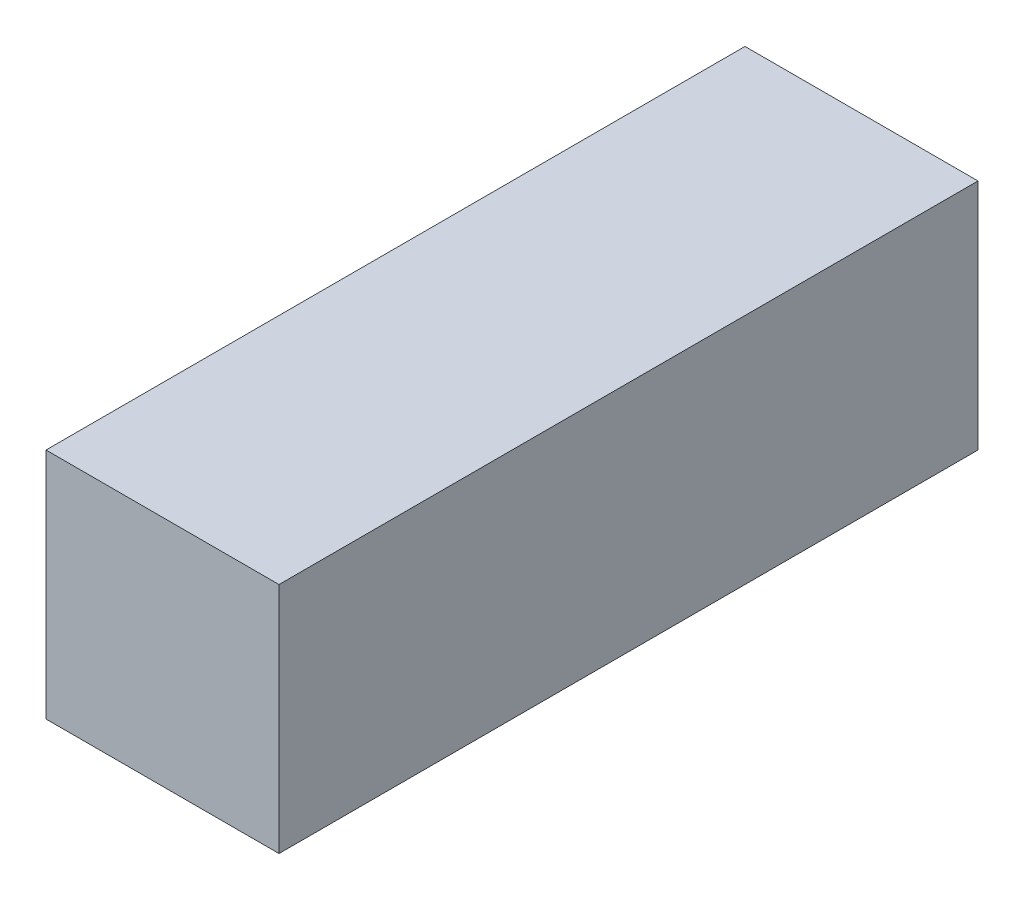
ISO-10303-21;
HEADER;
FILE_DESCRIPTION(('STEP AP214'),'2;1');
FILE_NAME('part.step','',(''),(''),'','','');
FILE_SCHEMA(('AUTOMOTIVE_DESIGN { 1 0 10303 214 1 1 1 1 }'));
ENDSEC;
DATA;
#1=APPLICATION_CONTEXT('core data for automotive mechanical design processes');
#2=APPLICATION_PROTOCOL_DEFINITION('international standard','automotive_design',2000,#1);
#3=PRODUCT_CONTEXT('',#1,'mechanical');
#4=PRODUCT('Part','Part','',(#3));
#5=PRODUCT_RELATED_PRODUCT_CATEGORY('part','',(#4));
#6=PRODUCT_DEFINITION_FORMATION('','',#4);
#7=PRODUCT_DEFINITION_CONTEXT('part definition',#1,'design');
#8=PRODUCT_DEFINITION('design','',#6,#7);
#9=PRODUCT_DEFINITION_SHAPE('','',#8);
#10=(LENGTH_UNIT() NAMED_UNIT(*) SI_UNIT(.MILLI.,.METRE.));
#11=(NAMED_UNIT(*) PLANE_ANGLE_UNIT() SI_UNIT($,.RADIAN.));
#12=(NAMED_UNIT(*) SI_UNIT($,.STERADIAN.) SOLID_ANGLE_UNIT());
#13=UNCERTAINTY_MEASURE_WITH_UNIT(LENGTH_MEASURE(1.E-05),#10,'distance_accuracy_value','');
#14=(GEOMETRIC_REPRESENTATION_CONTEXT(3) GLOBAL_UNCERTAINTY_ASSIGNED_CONTEXT((#13)) GLOBAL_UNIT_ASSIGNED_CONTEXT((#10,
#11,#12)) REPRESENTATION_CONTEXT('',''));
#15=CARTESIAN_POINT('',(0.,0.,0.));
#16=DIRECTION('',(0.,0.,1.));
#17=DIRECTION('',(1.,0.,0.));
#18=AXIS2_PLACEMENT_3D('',#15,#16,#17);
#19=CARTESIAN_POINT('',(6.35,-6.35,38.1));
#20=DIRECTION('',(-1.,0.,0.));
#21=DIRECTION('',(0.,0.,1.));
#22=AXIS2_PLACEMENT_3D('',#19,#20,#21);
#23=PLANE('',#22);
#24=DIRECTION('',(0.,1.,0.));
#25=VECTOR('',#24,1.);
#26=CARTESIAN_POINT('',(6.35,-6.35,0.));
#27=LINE('',#26,#25);
#28=CARTESIAN_POINT('',(6.35,-6.35,0.));
#29=VERTEX_POINT('',#28);
#30=CARTESIAN_POINT('',(6.35,6.35,0.));
#31=VERTEX_POINT('',#30);
#32=EDGE_CURVE('E102',#29,#31,#27,.T.);
#33=ORIENTED_EDGE('',*,*,#32,.T.);
#34=DIRECTION('',(0.,0.,-1.));
#35=VECTOR('',#34,1.);
#36=CARTESIAN_POINT('',(6.35,6.35,38.1));
#37=LINE('',#36,#35);
#38=CARTESIAN_POINT('',(6.35,6.35,38.1));
#39=VERTEX_POINT('',#38);
#40=EDGE_CURVE('E11',#39,#31,#37,.T.);
#41=ORIENTED_EDGE('',*,*,#40,.F.);
#42=DIRECTION('',(0.,1.,0.));
#43=VECTOR('',#42,1.);
#44=CARTESIAN_POINT('',(6.35,-6.35,38.1));
#45=LINE('',#44,#43);
#46=CARTESIAN_POINT('',(6.35,-6.35,38.1));
#47=VERTEX_POINT('',#46);
#48=EDGE_CURVE('E90',#47,#39,#45,.T.);
#49=ORIENTED_EDGE('',*,*,#48,.F.);
#50=DIRECTION('',(0.,0.,-1.));
#51=VECTOR('',#50,1.);
#52=CARTESIAN_POINT('',(6.35,-6.35,38.1));
#53=LINE('',#52,#51);
#54=EDGE_CURVE('E98',#47,#29,#53,.T.);
#55=ORIENTED_EDGE('',*,*,#54,.T.);
#56=EDGE_LOOP('',(#33,#41,#49,#55));
#57=FACE_BOUND('',#56,.T.);
#58=ADVANCED_FACE('F39',(#57),#23,.F.);
#59=CARTESIAN_POINT('',(-6.35,6.35,38.1));
#60=DIRECTION('',(0.,-1.,0.));
#61=DIRECTION('',(0.,0.,-1.));
#62=AXIS2_PLACEMENT_3D('',#59,#60,#61);
#63=PLANE('',#62);
#64=DIRECTION('',(-1.,0.,0.));
#65=VECTOR('',#64,1.);
#66=CARTESIAN_POINT('',(-6.35,6.35,0.));
#67=LINE('',#66,#65);
#68=CARTESIAN_POINT('',(-6.35,6.35,0.));
#69=VERTEX_POINT('',#68);
#70=EDGE_CURVE('E94',#31,#69,#67,.T.);
#71=ORIENTED_EDGE('',*,*,#70,.T.);
#72=DIRECTION('',(0.,0.,-1.));
#73=VECTOR('',#72,1.);
#74=CARTESIAN_POINT('',(-6.35,6.35,38.1));
#75=LINE('',#74,#73);
#76=CARTESIAN_POINT('',(-6.35,6.35,38.1));
#77=VERTEX_POINT('',#76);
#78=EDGE_CURVE('E47',#77,#69,#75,.T.);
#79=ORIENTED_EDGE('',*,*,#78,.F.);
#80=DIRECTION('',(-1.,0.,0.));
#81=VECTOR('',#80,1.);
#82=CARTESIAN_POINT('',(-6.35,6.35,38.1));
#83=LINE('',#82,#81);
#84=EDGE_CURVE('E85',#39,#77,#83,.T.);
#85=ORIENTED_EDGE('',*,*,#84,.F.);
#86=ORIENTED_EDGE('',*,*,#40,.T.);
#87=EDGE_LOOP('',(#71,#79,#85,#86));
#88=FACE_BOUND('',#87,.T.);
#89=ADVANCED_FACE('F93',(#88),#63,.F.);
#90=CARTESIAN_POINT('',(-6.35,-6.35,38.1));
#91=DIRECTION('',(1.,0.,0.));
#92=DIRECTION('',(0.,0.,-1.));
#93=AXIS2_PLACEMENT_3D('',#90,#91,#92);
#94=PLANE('',#93);
#95=DIRECTION('',(0.,-1.,0.));
#96=VECTOR('',#95,1.);
#97=CARTESIAN_POINT('',(-6.35,-6.35,0.));
#98=LINE('',#97,#96);
#99=CARTESIAN_POINT('',(-6.35,-6.35,0.));
#100=VERTEX_POINT('',#99);
#101=EDGE_CURVE('E72',#69,#100,#98,.T.);
#102=ORIENTED_EDGE('',*,*,#101,.T.);
#103=DIRECTION('',(0.,0.,-1.));
#104=VECTOR('',#103,1.);
#105=CARTESIAN_POINT('',(-6.35,-6.35,38.1));
#106=LINE('',#105,#104);
#107=CARTESIAN_POINT('',(-6.35,-6.35,38.1));
#108=VERTEX_POINT('',#107);
#109=EDGE_CURVE('E95',#108,#100,#106,.T.);
#110=ORIENTED_EDGE('',*,*,#109,.F.);
#111=DIRECTION('',(0.,-1.,0.));
#112=VECTOR('',#111,1.);
#113=CARTESIAN_POINT('',(-6.35,-6.35,38.1));
#114=LINE('',#113,#112);
#115=EDGE_CURVE('E88',#77,#108,#114,.T.);
#116=ORIENTED_EDGE('',*,*,#115,.F.);
#117=ORIENTED_EDGE('',*,*,#78,.T.);
#118=EDGE_LOOP('',(#102,#110,#116,#117));
#119=FACE_BOUND('',#118,.T.);
#120=ADVANCED_FACE('F96',(#119),#94,.F.);
#121=CARTESIAN_POINT('',(-6.35,-6.35,38.1));
#122=DIRECTION('',(0.,1.,0.));
#123=DIRECTION('',(0.,0.,1.));
#124=AXIS2_PLACEMENT_3D('',#121,#122,#123);
#125=PLANE('',#124);
#126=DIRECTION('',(1.,0.,0.));
#127=VECTOR('',#126,1.);
#128=CARTESIAN_POINT('',(-6.35,-6.35,0.));
#129=LINE('',#128,#127);
#130=EDGE_CURVE('E78',#100,#29,#129,.T.);
#131=ORIENTED_EDGE('',*,*,#130,.T.);
#132=ORIENTED_EDGE('',*,*,#54,.F.);
#133=DIRECTION('',(1.,0.,0.));
#134=VECTOR('',#133,1.);
#135=CARTESIAN_POINT('',(-6.35,-6.35,38.1));
#136=LINE('',#135,#134);
#137=EDGE_CURVE('E55',#108,#47,#136,.T.);
#138=ORIENTED_EDGE('',*,*,#137,.F.);
#139=ORIENTED_EDGE('',*,*,#109,.T.);
#140=EDGE_LOOP('',(#131,#132,#138,#139));
#141=FACE_BOUND('',#140,.T.);
#142=ADVANCED_FACE('F109',(#141),#125,.F.);
#143=CARTESIAN_POINT('',(0.,0.,38.1));
#144=DIRECTION('',(0.,0.,-1.));
#145=DIRECTION('',(-1.,0.,0.));
#146=AXIS2_PLACEMENT_3D('',#143,#144,#145);
#147=PLANE('',#146);
#148=ORIENTED_EDGE('',*,*,#48,.T.);
#149=ORIENTED_EDGE('',*,*,#84,.T.);
#150=ORIENTED_EDGE('',*,*,#115,.T.);
#151=ORIENTED_EDGE('',*,*,#137,.T.);
#152=EDGE_LOOP('',(#148,#149,#150,#151));
#153=FACE_BOUND('',#152,.T.);
#154=ADVANCED_FACE('F86',(#153),#147,.F.);
#155=CARTESIAN_POINT('',(0.,0.,0.));
#156=DIRECTION('',(0.,0.,-1.));
#157=DIRECTION('',(-1.,0.,0.));
#158=AXIS2_PLACEMENT_3D('',#155,#156,#157);
#159=PLANE('',#158);
#160=ORIENTED_EDGE('',*,*,#32,.F.);
#161=ORIENTED_EDGE('',*,*,#130,.F.);
#162=ORIENTED_EDGE('',*,*,#101,.F.);
#163=ORIENTED_EDGE('',*,*,#70,.F.);
#164=EDGE_LOOP('',(#160,#161,#162,#163));
#165=FACE_BOUND('',#164,.T.);
#166=ADVANCED_FACE('F112',(#165),#159,.T.);
#167=CLOSED_SHELL('',(#58,#89,#120,#142,#154,#166));
#168=MANIFOLD_SOLID_BREP('B2',#167);
#169=ADVANCED_BREP_SHAPE_REPRESENTATION('',(#18,#168),#14);
#170=SHAPE_DEFINITION_REPRESENTATION(#9,#169);
ENDSEC;
END-ISO-10303-21;
